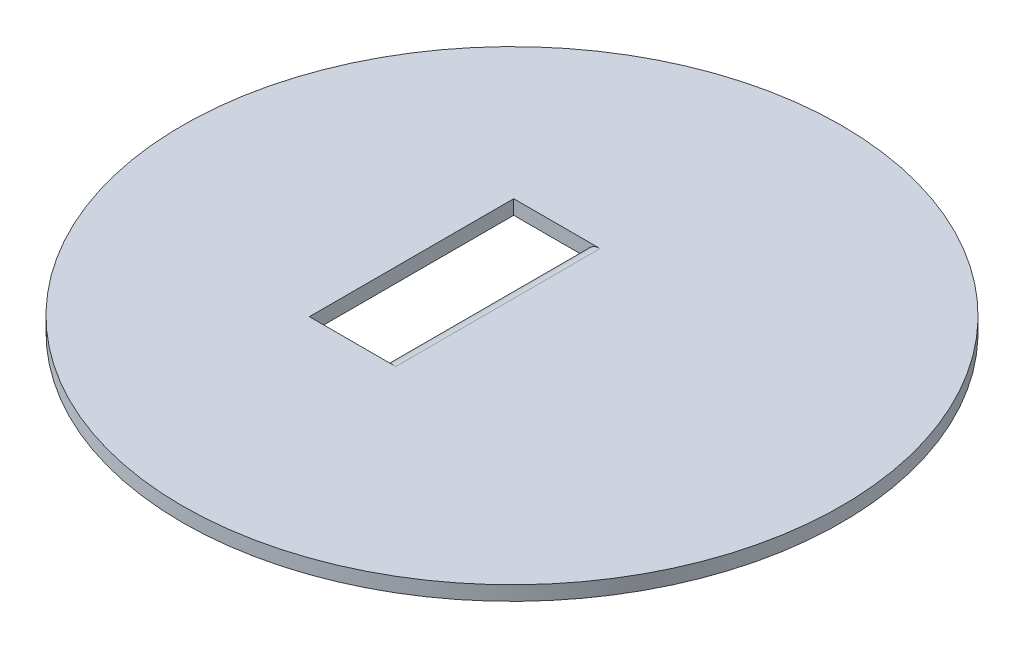
ISO-10303-21;
HEADER;
FILE_DESCRIPTION(('STEP AP214'),'2;1');
FILE_NAME('part.step','',(''),(''),'','','');
FILE_SCHEMA(('AUTOMOTIVE_DESIGN { 1 0 10303 214 1 1 1 1 }'));
ENDSEC;
DATA;
#1=APPLICATION_CONTEXT('core data for automotive mechanical design processes');
#2=APPLICATION_PROTOCOL_DEFINITION('international standard','automotive_design',2000,#1);
#3=PRODUCT_CONTEXT('',#1,'mechanical');
#4=PRODUCT('Part','Part','',(#3));
#5=PRODUCT_RELATED_PRODUCT_CATEGORY('part','',(#4));
#6=PRODUCT_DEFINITION_FORMATION('','',#4);
#7=PRODUCT_DEFINITION_CONTEXT('part definition',#1,'design');
#8=PRODUCT_DEFINITION('design','',#6,#7);
#9=PRODUCT_DEFINITION_SHAPE('','',#8);
#10=(LENGTH_UNIT() NAMED_UNIT(*) SI_UNIT(.MILLI.,.METRE.));
#11=(NAMED_UNIT(*) PLANE_ANGLE_UNIT() SI_UNIT($,.RADIAN.));
#12=(NAMED_UNIT(*) SI_UNIT($,.STERADIAN.) SOLID_ANGLE_UNIT());
#13=UNCERTAINTY_MEASURE_WITH_UNIT(LENGTH_MEASURE(1.E-05),#10,'distance_accuracy_value','');
#14=(GEOMETRIC_REPRESENTATION_CONTEXT(3) GLOBAL_UNCERTAINTY_ASSIGNED_CONTEXT((#13)) GLOBAL_UNIT_ASSIGNED_CONTEXT((#10,
#11,#12)) REPRESENTATION_CONTEXT('',''));
#15=CARTESIAN_POINT('',(0.,0.,0.));
#16=DIRECTION('',(0.,0.,1.));
#17=DIRECTION('',(1.,0.,0.));
#18=AXIS2_PLACEMENT_3D('',#15,#16,#17);
#19=CARTESIAN_POINT('',(0.,0.,0.));
#20=DIRECTION('',(0.,1.,0.));
#21=DIRECTION('',(0.,0.,1.));
#22=AXIS2_PLACEMENT_3D('',#19,#20,#21);
#23=PLANE('',#22);
#24=DIRECTION('',(1.,0.,0.));
#25=VECTOR('',#24,1.);
#26=CARTESIAN_POINT('',(-21.7715410570772,0.,-7.1));
#27=LINE('',#26,#25);
#28=CARTESIAN_POINT('',(-6.98047517546045,0.,-7.10000000000001));
#29=VERTEX_POINT('',#28);
#30=CARTESIAN_POINT('',(-1.98047517546045,0.,-7.1));
#31=VERTEX_POINT('',#30);
#32=EDGE_CURVE('E131',#29,#31,#27,.T.);
#33=ORIENTED_EDGE('',*,*,#32,.F.);
#34=DIRECTION('',(0.,0.,1.));
#35=VECTOR('',#34,1.);
#36=CARTESIAN_POINT('',(-6.98047517546045,0.,7.1));
#37=LINE('',#36,#35);
#38=CARTESIAN_POINT('',(-6.98047517546045,0.,7.1));
#39=VERTEX_POINT('',#38);
#40=EDGE_CURVE('E146',#29,#39,#37,.T.);
#41=ORIENTED_EDGE('',*,*,#40,.T.);
#42=DIRECTION('',(-1.,0.,0.));
#43=VECTOR('',#42,1.);
#44=CARTESIAN_POINT('',(-1.98047517546045,0.,7.1));
#45=LINE('',#44,#43);
#46=CARTESIAN_POINT('',(-1.98047517546045,0.,7.1));
#47=VERTEX_POINT('',#46);
#48=EDGE_CURVE('E111',#47,#39,#45,.T.);
#49=ORIENTED_EDGE('',*,*,#48,.F.);
#50=DIRECTION('',(0.,0.,1.));
#51=VECTOR('',#50,1.);
#52=CARTESIAN_POINT('',(-1.98047517546045,0.,-7.1));
#53=LINE('',#52,#51);
#54=EDGE_CURVE('E134',#31,#47,#53,.T.);
#55=ORIENTED_EDGE('',*,*,#54,.F.);
#56=EDGE_LOOP('',(#33,#41,#49,#55));
#57=FACE_BOUND('',#56,.T.);
#58=CARTESIAN_POINT('',(0.,0.,0.));
#59=DIRECTION('',(0.,1.,0.));
#60=DIRECTION('',(0.,0.,1.));
#61=AXIS2_PLACEMENT_3D('',#58,#59,#60);
#62=CIRCLE('',#61,22.9);
#63=CARTESIAN_POINT('',(0.,0.,22.9));
#64=VERTEX_POINT('',#63);
#65=EDGE_CURVE('E128',#64,#64,#62,.T.);
#66=ORIENTED_EDGE('',*,*,#65,.F.);
#67=EDGE_LOOP('',(#66));
#68=FACE_BOUND('',#67,.T.);
#69=CARTESIAN_POINT('',(-11.6424908306669,0.,11.));
#70=DIRECTION('',(0.,1.,0.));
#71=DIRECTION('',(0.,0.,1.));
#72=AXIS2_PLACEMENT_3D('',#69,#70,#71);
#73=CIRCLE('',#72,1.9);
#74=CARTESIAN_POINT('',(-11.6424908306669,0.,12.9));
#75=VERTEX_POINT('',#74);
#76=EDGE_CURVE('E118',#75,#75,#73,.F.);
#77=ORIENTED_EDGE('',*,*,#76,.F.);
#78=EDGE_LOOP('',(#77));
#79=FACE_BOUND('',#78,.T.);
#80=CARTESIAN_POINT('',(-11.6424908306669,0.,-11.));
#81=DIRECTION('',(0.,1.,0.));
#82=DIRECTION('',(0.,0.,1.));
#83=AXIS2_PLACEMENT_3D('',#80,#81,#82);
#84=CIRCLE('',#83,1.9);
#85=CARTESIAN_POINT('',(-11.6424908306669,0.,-9.1));
#86=VERTEX_POINT('',#85);
#87=EDGE_CURVE('E122',#86,#86,#84,.F.);
#88=ORIENTED_EDGE('',*,*,#87,.F.);
#89=EDGE_LOOP('',(#88));
#90=FACE_BOUND('',#89,.T.);
#91=DIRECTION('',(1.,0.,0.));
#92=VECTOR('',#91,1.);
#93=CARTESIAN_POINT('',(14.9,0.,-14.6403760248598));
#94=LINE('',#93,#92);
#95=CARTESIAN_POINT('',(5.1,0.,-14.6403760248598));
#96=VERTEX_POINT('',#95);
#97=CARTESIAN_POINT('',(14.9,0.,-14.6403760248598));
#98=VERTEX_POINT('',#97);
#99=EDGE_CURVE('E150',#96,#98,#94,.T.);
#100=ORIENTED_EDGE('',*,*,#99,.F.);
#101=DIRECTION('',(0.,0.,-1.));
#102=VECTOR('',#101,1.);
#103=CARTESIAN_POINT('',(5.1,0.,-14.6403760248598));
#104=LINE('',#103,#102);
#105=CARTESIAN_POINT('',(5.1,0.,14.6403760248598));
#106=VERTEX_POINT('',#105);
#107=EDGE_CURVE('E157',#106,#96,#104,.T.);
#108=ORIENTED_EDGE('',*,*,#107,.F.);
#109=DIRECTION('',(-1.,0.,0.));
#110=VECTOR('',#109,1.);
#111=CARTESIAN_POINT('',(5.1,0.,14.6403760248598));
#112=LINE('',#111,#110);
#113=CARTESIAN_POINT('',(14.9,0.,14.6403760248598));
#114=VERTEX_POINT('',#113);
#115=EDGE_CURVE('E169',#114,#106,#112,.T.);
#116=ORIENTED_EDGE('',*,*,#115,.F.);
#117=DIRECTION('',(0.,0.,1.));
#118=VECTOR('',#117,1.);
#119=CARTESIAN_POINT('',(14.9,0.,14.6403760248598));
#120=LINE('',#119,#118);
#121=EDGE_CURVE('E166',#98,#114,#120,.T.);
#122=ORIENTED_EDGE('',*,*,#121,.F.);
#123=EDGE_LOOP('',(#100,#108,#116,#122));
#124=FACE_BOUND('',#123,.T.);
#125=ADVANCED_FACE('F38',(#57,#68,#79,#90,#124),#23,.F.);
#126=CARTESIAN_POINT('',(0.,1.,0.));
#127=DIRECTION('',(0.,-1.,0.));
#128=DIRECTION('',(0.,0.,-1.));
#129=AXIS2_PLACEMENT_3D('',#126,#127,#128);
#130=CYLINDRICAL_SURFACE('',#129,22.9);
#131=ORIENTED_EDGE('',*,*,#65,.T.);
#132=EDGE_LOOP('',(#131));
#133=FACE_BOUND('',#132,.T.);
#134=CARTESIAN_POINT('',(0.,1.,0.));
#135=DIRECTION('',(0.,1.,0.));
#136=DIRECTION('',(0.,0.,1.));
#137=AXIS2_PLACEMENT_3D('',#134,#135,#136);
#138=CIRCLE('',#137,22.9);
#139=CARTESIAN_POINT('',(0.,1.,22.9));
#140=VERTEX_POINT('',#139);
#141=EDGE_CURVE('E124',#140,#140,#138,.T.);
#142=ORIENTED_EDGE('',*,*,#141,.F.);
#143=EDGE_LOOP('',(#142));
#144=FACE_BOUND('',#143,.T.);
#145=ADVANCED_FACE('F192',(#133,#144),#130,.T.);
#146=CARTESIAN_POINT('',(-21.7715410570772,1.,-7.1));
#147=DIRECTION('',(0.,0.,-1.));
#148=DIRECTION('',(-1.,0.,0.));
#149=AXIS2_PLACEMENT_3D('',#146,#147,#148);
#150=PLANE('',#149);
#151=DIRECTION('',(1.,0.,0.));
#152=VECTOR('',#151,1.);
#153=CARTESIAN_POINT('',(-21.7715410570772,1.,-7.1));
#154=LINE('',#153,#152);
#155=CARTESIAN_POINT('',(-6.98047517546045,1.,-7.1));
#156=VERTEX_POINT('',#155);
#157=CARTESIAN_POINT('',(-0.980475175460457,1.,-7.1));
#158=VERTEX_POINT('',#157);
#159=EDGE_CURVE('E119',#156,#158,#154,.T.);
#160=ORIENTED_EDGE('',*,*,#159,.F.);
#161=DIRECTION('',(0.,1.,0.));
#162=VECTOR('',#161,1.);
#163=CARTESIAN_POINT('',(-6.98047517546045,-21.332399551835,-7.1));
#164=LINE('',#163,#162);
#165=EDGE_CURVE('E106',#29,#156,#164,.T.);
#166=ORIENTED_EDGE('',*,*,#165,.F.);
#167=ORIENTED_EDGE('',*,*,#32,.T.);
#168=CARTESIAN_POINT('',(-0.98047517546045,0.,-7.1));
#169=DIRECTION('',(0.,0.,-1.));
#170=DIRECTION('',(-1.,0.,0.));
#171=AXIS2_PLACEMENT_3D('',#168,#169,#170);
#172=CIRCLE('',#171,1.);
#173=EDGE_CURVE('E11',#31,#158,#172,.T.);
#174=ORIENTED_EDGE('',*,*,#173,.T.);
#175=EDGE_LOOP('',(#160,#166,#167,#174));
#176=FACE_BOUND('',#175,.T.);
#177=ADVANCED_FACE('F148',(#176),#150,.F.);
#178=CARTESIAN_POINT('',(-1.98047517546045,1.,7.1));
#179=DIRECTION('',(0.,0.,1.));
#180=DIRECTION('',(1.,0.,0.));
#181=AXIS2_PLACEMENT_3D('',#178,#179,#180);
#182=PLANE('',#181);
#183=ORIENTED_EDGE('',*,*,#48,.T.);
#184=DIRECTION('',(0.,1.,0.));
#185=VECTOR('',#184,1.);
#186=CARTESIAN_POINT('',(-6.98047517546045,-21.332399551835,7.1));
#187=LINE('',#186,#185);
#188=CARTESIAN_POINT('',(-6.98047517546045,1.,7.1));
#189=VERTEX_POINT('',#188);
#190=EDGE_CURVE('E103',#39,#189,#187,.T.);
#191=ORIENTED_EDGE('',*,*,#190,.T.);
#192=DIRECTION('',(-1.,0.,0.));
#193=VECTOR('',#192,1.);
#194=CARTESIAN_POINT('',(-1.98047517546045,1.,7.1));
#195=LINE('',#194,#193);
#196=CARTESIAN_POINT('',(-0.98047517546045,1.,7.1));
#197=VERTEX_POINT('',#196);
#198=EDGE_CURVE('E60',#197,#189,#195,.T.);
#199=ORIENTED_EDGE('',*,*,#198,.F.);
#200=CARTESIAN_POINT('',(-0.98047517546045,0.,7.1));
#201=DIRECTION('',(0.,0.,1.));
#202=DIRECTION('',(1.,0.,0.));
#203=AXIS2_PLACEMENT_3D('',#200,#201,#202);
#204=CIRCLE('',#203,1.);
#205=EDGE_CURVE('E46',#197,#47,#204,.T.);
#206=ORIENTED_EDGE('',*,*,#205,.T.);
#207=EDGE_LOOP('',(#183,#191,#199,#206));
#208=FACE_BOUND('',#207,.T.);
#209=ADVANCED_FACE('F109',(#208),#182,.F.);
#210=CARTESIAN_POINT('',(0.,1.,0.));
#211=DIRECTION('',(0.,1.,0.));
#212=DIRECTION('',(0.,0.,1.));
#213=AXIS2_PLACEMENT_3D('',#210,#211,#212);
#214=PLANE('',#213);
#215=DIRECTION('',(0.,0.,-1.));
#216=VECTOR('',#215,1.);
#217=CARTESIAN_POINT('',(-6.98047517546045,1.,7.1));
#218=LINE('',#217,#216);
#219=EDGE_CURVE('E53',#189,#156,#218,.T.);
#220=ORIENTED_EDGE('',*,*,#219,.T.);
#221=ORIENTED_EDGE('',*,*,#159,.T.);
#222=DIRECTION('',(0.,0.,1.));
#223=VECTOR('',#222,1.);
#224=CARTESIAN_POINT('',(-0.98047517546045,1.,7.1));
#225=LINE('',#224,#223);
#226=EDGE_CURVE('E117',#158,#197,#225,.T.);
#227=ORIENTED_EDGE('',*,*,#226,.T.);
#228=ORIENTED_EDGE('',*,*,#198,.T.);
#229=EDGE_LOOP('',(#220,#221,#227,#228));
#230=FACE_BOUND('',#229,.T.);
#231=ORIENTED_EDGE('',*,*,#141,.T.);
#232=EDGE_LOOP('',(#231));
#233=FACE_BOUND('',#232,.T.);
#234=ADVANCED_FACE('F114',(#230,#233),#214,.T.);
#235=CARTESIAN_POINT('',(-11.6424908306669,-0.5,11.));
#236=DIRECTION('',(0.,1.,0.));
#237=DIRECTION('',(0.,0.,1.));
#238=AXIS2_PLACEMENT_3D('',#235,#236,#237);
#239=CYLINDRICAL_SURFACE('',#238,1.9);
#240=CARTESIAN_POINT('',(-11.6424908306669,-0.5,11.));
#241=DIRECTION('',(0.,-1.,0.));
#242=DIRECTION('',(0.,0.,-1.));
#243=AXIS2_PLACEMENT_3D('',#240,#241,#242);
#244=CIRCLE('',#243,1.9);
#245=CARTESIAN_POINT('',(-11.6424908306669,-0.5,9.1));
#246=VERTEX_POINT('',#245);
#247=EDGE_CURVE('E132',#246,#246,#244,.T.);
#248=ORIENTED_EDGE('',*,*,#247,.F.);
#249=EDGE_LOOP('',(#248));
#250=FACE_BOUND('',#249,.T.);
#251=ORIENTED_EDGE('',*,*,#76,.T.);
#252=EDGE_LOOP('',(#251));
#253=FACE_BOUND('',#252,.T.);
#254=ADVANCED_FACE('F206',(#250,#253),#239,.T.);
#255=CARTESIAN_POINT('',(-11.6424908306669,-0.5,11.));
#256=DIRECTION('',(0.,-1.,0.));
#257=DIRECTION('',(0.,0.,-1.));
#258=AXIS2_PLACEMENT_3D('',#255,#256,#257);
#259=PLANE('',#258);
#260=ORIENTED_EDGE('',*,*,#247,.T.);
#261=EDGE_LOOP('',(#260));
#262=FACE_BOUND('',#261,.T.);
#263=ADVANCED_FACE('F209',(#262),#259,.T.);
#264=CARTESIAN_POINT('',(-11.6424908306669,-0.5,-11.));
#265=DIRECTION('',(0.,1.,0.));
#266=DIRECTION('',(0.,0.,1.));
#267=AXIS2_PLACEMENT_3D('',#264,#265,#266);
#268=CYLINDRICAL_SURFACE('',#267,1.9);
#269=CARTESIAN_POINT('',(-11.6424908306669,-0.5,-11.));
#270=DIRECTION('',(0.,-1.,0.));
#271=DIRECTION('',(0.,0.,-1.));
#272=AXIS2_PLACEMENT_3D('',#269,#270,#271);
#273=CIRCLE('',#272,1.9);
#274=CARTESIAN_POINT('',(-11.6424908306669,-0.5,-12.9));
#275=VERTEX_POINT('',#274);
#276=EDGE_CURVE('E185',#275,#275,#273,.T.);
#277=ORIENTED_EDGE('',*,*,#276,.F.);
#278=EDGE_LOOP('',(#277));
#279=FACE_BOUND('',#278,.T.);
#280=ORIENTED_EDGE('',*,*,#87,.T.);
#281=EDGE_LOOP('',(#280));
#282=FACE_BOUND('',#281,.T.);
#283=ADVANCED_FACE('F213',(#279,#282),#268,.T.);
#284=CARTESIAN_POINT('',(-11.6424908306669,-0.5,-11.));
#285=DIRECTION('',(0.,-1.,0.));
#286=DIRECTION('',(0.,0.,-1.));
#287=AXIS2_PLACEMENT_3D('',#284,#285,#286);
#288=PLANE('',#287);
#289=ORIENTED_EDGE('',*,*,#276,.T.);
#290=EDGE_LOOP('',(#289));
#291=FACE_BOUND('',#290,.T.);
#292=ADVANCED_FACE('F217',(#291),#288,.T.);
#293=CARTESIAN_POINT('',(14.9,-0.5,-14.6403760248598));
#294=DIRECTION('',(0.,0.,1.));
#295=DIRECTION('',(1.,0.,0.));
#296=AXIS2_PLACEMENT_3D('',#293,#294,#295);
#297=PLANE('',#296);
#298=ORIENTED_EDGE('',*,*,#99,.T.);
#299=DIRECTION('',(0.,1.,0.));
#300=VECTOR('',#299,1.);
#301=CARTESIAN_POINT('',(14.9,-0.5,-14.6403760248598));
#302=LINE('',#301,#300);
#303=CARTESIAN_POINT('',(14.9,-0.5,-14.6403760248598));
#304=VERTEX_POINT('',#303);
#305=EDGE_CURVE('E182',#304,#98,#302,.T.);
#306=ORIENTED_EDGE('',*,*,#305,.F.);
#307=DIRECTION('',(1.,0.,0.));
#308=VECTOR('',#307,1.);
#309=CARTESIAN_POINT('',(14.9,-0.5,-14.6403760248598));
#310=LINE('',#309,#308);
#311=CARTESIAN_POINT('',(5.1,-0.5,-14.6403760248598));
#312=VERTEX_POINT('',#311);
#313=EDGE_CURVE('E153',#312,#304,#310,.T.);
#314=ORIENTED_EDGE('',*,*,#313,.F.);
#315=DIRECTION('',(0.,1.,0.));
#316=VECTOR('',#315,1.);
#317=CARTESIAN_POINT('',(5.1,-0.5,-14.6403760248598));
#318=LINE('',#317,#316);
#319=EDGE_CURVE('E163',#312,#96,#318,.T.);
#320=ORIENTED_EDGE('',*,*,#319,.T.);
#321=EDGE_LOOP('',(#298,#306,#314,#320));
#322=FACE_BOUND('',#321,.T.);
#323=ADVANCED_FACE('F221',(#322),#297,.F.);
#324=CARTESIAN_POINT('',(14.9,-0.5,14.6403760248598));
#325=DIRECTION('',(-1.,0.,0.));
#326=DIRECTION('',(0.,0.,1.));
#327=AXIS2_PLACEMENT_3D('',#324,#325,#326);
#328=PLANE('',#327);
#329=ORIENTED_EDGE('',*,*,#121,.T.);
#330=DIRECTION('',(0.,1.,0.));
#331=VECTOR('',#330,1.);
#332=CARTESIAN_POINT('',(14.9,-0.5,14.6403760248598));
#333=LINE('',#332,#331);
#334=CARTESIAN_POINT('',(14.9,-0.5,14.6403760248598));
#335=VERTEX_POINT('',#334);
#336=EDGE_CURVE('E179',#335,#114,#333,.T.);
#337=ORIENTED_EDGE('',*,*,#336,.F.);
#338=DIRECTION('',(0.,0.,1.));
#339=VECTOR('',#338,1.);
#340=CARTESIAN_POINT('',(14.9,-0.5,14.6403760248598));
#341=LINE('',#340,#339);
#342=EDGE_CURVE('E156',#304,#335,#341,.T.);
#343=ORIENTED_EDGE('',*,*,#342,.F.);
#344=ORIENTED_EDGE('',*,*,#305,.T.);
#345=EDGE_LOOP('',(#329,#337,#343,#344));
#346=FACE_BOUND('',#345,.T.);
#347=ADVANCED_FACE('F225',(#346),#328,.F.);
#348=CARTESIAN_POINT('',(5.1,-0.5,14.6403760248598));
#349=DIRECTION('',(0.,0.,-1.));
#350=DIRECTION('',(-1.,0.,0.));
#351=AXIS2_PLACEMENT_3D('',#348,#349,#350);
#352=PLANE('',#351);
#353=ORIENTED_EDGE('',*,*,#115,.T.);
#354=DIRECTION('',(0.,1.,0.));
#355=VECTOR('',#354,1.);
#356=CARTESIAN_POINT('',(5.1,-0.5,14.6403760248598));
#357=LINE('',#356,#355);
#358=CARTESIAN_POINT('',(5.1,-0.5,14.6403760248598));
#359=VERTEX_POINT('',#358);
#360=EDGE_CURVE('E176',#359,#106,#357,.T.);
#361=ORIENTED_EDGE('',*,*,#360,.F.);
#362=DIRECTION('',(-1.,0.,0.));
#363=VECTOR('',#362,1.);
#364=CARTESIAN_POINT('',(5.1,-0.5,14.6403760248598));
#365=LINE('',#364,#363);
#366=EDGE_CURVE('E159',#335,#359,#365,.T.);
#367=ORIENTED_EDGE('',*,*,#366,.F.);
#368=ORIENTED_EDGE('',*,*,#336,.T.);
#369=EDGE_LOOP('',(#353,#361,#367,#368));
#370=FACE_BOUND('',#369,.T.);
#371=ADVANCED_FACE('F229',(#370),#352,.F.);
#372=CARTESIAN_POINT('',(5.1,-0.5,-14.6403760248598));
#373=DIRECTION('',(1.,0.,0.));
#374=DIRECTION('',(0.,0.,-1.));
#375=AXIS2_PLACEMENT_3D('',#372,#373,#374);
#376=PLANE('',#375);
#377=ORIENTED_EDGE('',*,*,#107,.T.);
#378=ORIENTED_EDGE('',*,*,#319,.F.);
#379=DIRECTION('',(0.,0.,-1.));
#380=VECTOR('',#379,1.);
#381=CARTESIAN_POINT('',(5.1,-0.5,-14.6403760248598));
#382=LINE('',#381,#380);
#383=EDGE_CURVE('E161',#359,#312,#382,.T.);
#384=ORIENTED_EDGE('',*,*,#383,.F.);
#385=ORIENTED_EDGE('',*,*,#360,.T.);
#386=EDGE_LOOP('',(#377,#378,#384,#385));
#387=FACE_BOUND('',#386,.T.);
#388=ADVANCED_FACE('F233',(#387),#376,.F.);
#389=CARTESIAN_POINT('',(0.,-0.5,0.));
#390=DIRECTION('',(0.,1.,0.));
#391=DIRECTION('',(0.,0.,1.));
#392=AXIS2_PLACEMENT_3D('',#389,#390,#391);
#393=PLANE('',#392);
#394=ORIENTED_EDGE('',*,*,#313,.T.);
#395=ORIENTED_EDGE('',*,*,#342,.T.);
#396=ORIENTED_EDGE('',*,*,#366,.T.);
#397=ORIENTED_EDGE('',*,*,#383,.T.);
#398=EDGE_LOOP('',(#394,#395,#396,#397));
#399=FACE_BOUND('',#398,.T.);
#400=ADVANCED_FACE('F237',(#399),#393,.F.);
#401=CARTESIAN_POINT('',(-0.98047517546045,0.,0.));
#402=DIRECTION('',(0.,0.,-1.));
#403=DIRECTION('',(-1.,0.,0.));
#404=AXIS2_PLACEMENT_3D('',#401,#402,#403);
#405=CYLINDRICAL_SURFACE('',#404,1.);
#406=ORIENTED_EDGE('',*,*,#173,.F.);
#407=ORIENTED_EDGE('',*,*,#54,.T.);
#408=ORIENTED_EDGE('',*,*,#205,.F.);
#409=ORIENTED_EDGE('',*,*,#226,.F.);
#410=EDGE_LOOP('',(#406,#407,#408,#409));
#411=FACE_BOUND('',#410,.T.);
#412=ADVANCED_FACE('F40',(#411),#405,.T.);
#413=CARTESIAN_POINT('',(-6.98047517546045,-21.332399551835,7.1));
#414=DIRECTION('',(1.,0.,0.));
#415=DIRECTION('',(0.,0.,-1.));
#416=AXIS2_PLACEMENT_3D('',#413,#414,#415);
#417=PLANE('',#416);
#418=ORIENTED_EDGE('',*,*,#40,.F.);
#419=ORIENTED_EDGE('',*,*,#165,.T.);
#420=ORIENTED_EDGE('',*,*,#219,.F.);
#421=ORIENTED_EDGE('',*,*,#190,.F.);
#422=EDGE_LOOP('',(#418,#419,#420,#421));
#423=FACE_BOUND('',#422,.T.);
#424=ADVANCED_FACE('F102',(#423),#417,.T.);
#425=CLOSED_SHELL('',(#125,#145,#177,#209,#234,#254,#263,#283,#292,#323,#347,#371,#388,#400,
#412,#424));
#426=MANIFOLD_SOLID_BREP('B2',#425);
#427=ADVANCED_BREP_SHAPE_REPRESENTATION('',(#18,#426),#14);
#428=SHAPE_DEFINITION_REPRESENTATION(#9,#427);
ENDSEC;
END-ISO-10303-21;
